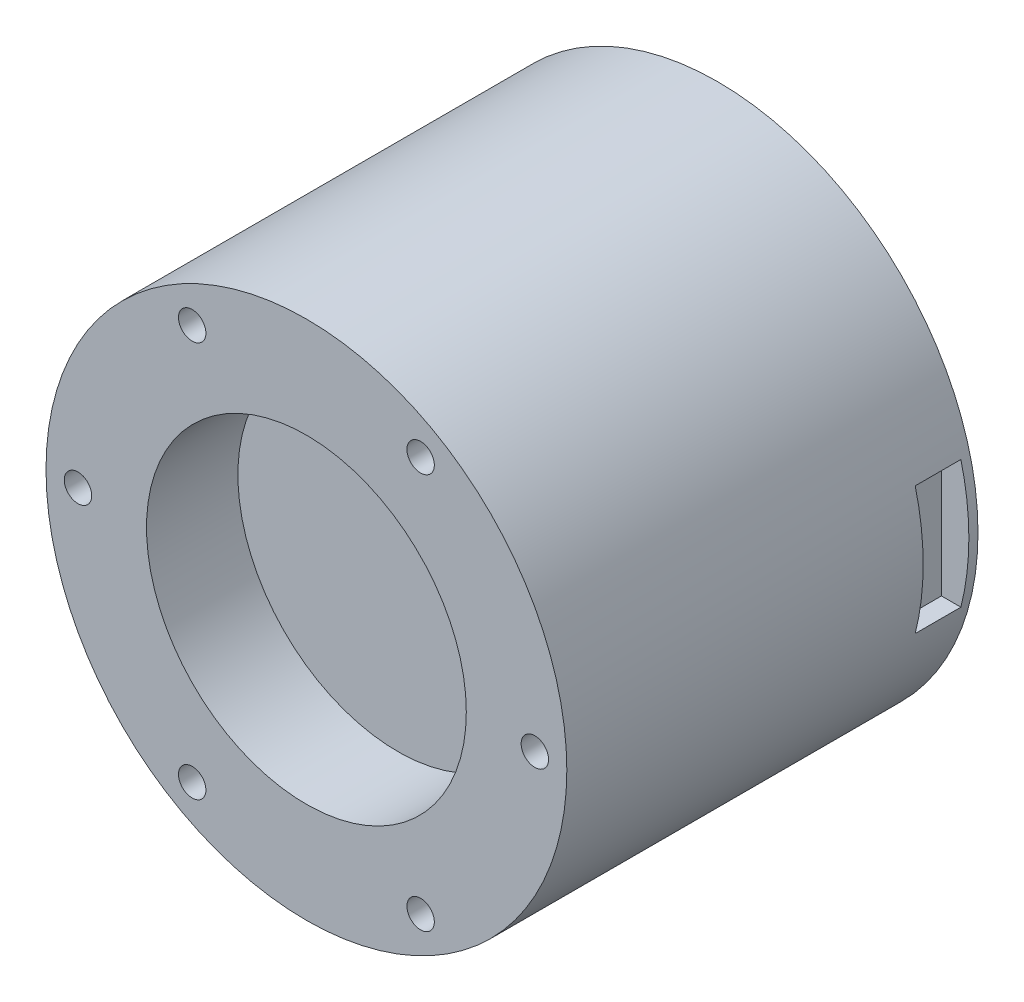
ISO-10303-21;
HEADER;
FILE_DESCRIPTION(('STEP AP214'),'2;1');
FILE_NAME('part.step','',(''),(''),'','','');
FILE_SCHEMA(('AUTOMOTIVE_DESIGN { 1 0 10303 214 1 1 1 1 }'));
ENDSEC;
DATA;
#1=APPLICATION_CONTEXT('core data for automotive mechanical design processes');
#2=APPLICATION_PROTOCOL_DEFINITION('international standard','automotive_design',2000,#1);
#3=PRODUCT_CONTEXT('',#1,'mechanical');
#4=PRODUCT('Part','Part','',(#3));
#5=PRODUCT_RELATED_PRODUCT_CATEGORY('part','',(#4));
#6=PRODUCT_DEFINITION_FORMATION('','',#4);
#7=PRODUCT_DEFINITION_CONTEXT('part definition',#1,'design');
#8=PRODUCT_DEFINITION('design','',#6,#7);
#9=PRODUCT_DEFINITION_SHAPE('','',#8);
#10=(LENGTH_UNIT() NAMED_UNIT(*) SI_UNIT(.MILLI.,.METRE.));
#11=(NAMED_UNIT(*) PLANE_ANGLE_UNIT() SI_UNIT($,.RADIAN.));
#12=(NAMED_UNIT(*) SI_UNIT($,.STERADIAN.) SOLID_ANGLE_UNIT());
#13=UNCERTAINTY_MEASURE_WITH_UNIT(LENGTH_MEASURE(1.E-05),#10,'distance_accuracy_value','');
#14=(GEOMETRIC_REPRESENTATION_CONTEXT(3) GLOBAL_UNCERTAINTY_ASSIGNED_CONTEXT((#13)) GLOBAL_UNIT_ASSIGNED_CONTEXT((#10,
#11,#12)) REPRESENTATION_CONTEXT('',''));
#15=CARTESIAN_POINT('',(0.,0.,0.));
#16=DIRECTION('',(0.,0.,1.));
#17=DIRECTION('',(1.,0.,0.));
#18=AXIS2_PLACEMENT_3D('',#15,#16,#17);
#19=CARTESIAN_POINT('',(0.,0.,45.));
#20=DIRECTION('',(0.,0.,-1.));
#21=DIRECTION('',(-1.,0.,0.));
#22=AXIS2_PLACEMENT_3D('',#19,#20,#21);
#23=CYLINDRICAL_SURFACE('',#22,28.5);
#24=DIRECTION('',(0.,0.,-1.));
#25=VECTOR('',#24,1.);
#26=CARTESIAN_POINT('',(-4.00000000000001,-28.2179021190449,9.));
#27=LINE('',#26,#25);
#28=CARTESIAN_POINT('',(-4.00000000000001,-28.2179021190449,9.));
#29=VERTEX_POINT('',#28);
#30=CARTESIAN_POINT('',(-4.00000000000001,-28.2179021190449,1.));
#31=VERTEX_POINT('',#30);
#32=EDGE_CURVE('E141',#29,#31,#27,.T.);
#33=ORIENTED_EDGE('',*,*,#32,.F.);
#34=CARTESIAN_POINT('',(0.,0.,9.));
#35=DIRECTION('',(0.,0.,-1.));
#36=DIRECTION('',(1.,0.,0.));
#37=AXIS2_PLACEMENT_3D('',#34,#35,#36);
#38=CIRCLE('',#37,28.5);
#39=CARTESIAN_POINT('',(3.99999999999999,-28.2179021190449,9.));
#40=VERTEX_POINT('',#39);
#41=EDGE_CURVE('E148',#40,#29,#38,.T.);
#42=ORIENTED_EDGE('',*,*,#41,.F.);
#43=DIRECTION('',(0.,0.,-1.));
#44=VECTOR('',#43,1.);
#45=CARTESIAN_POINT('',(3.99999999999999,-28.2179021190449,9.));
#46=LINE('',#45,#44);
#47=CARTESIAN_POINT('',(3.99999999999999,-28.2179021190449,1.));
#48=VERTEX_POINT('',#47);
#49=EDGE_CURVE('E131',#40,#48,#46,.T.);
#50=ORIENTED_EDGE('',*,*,#49,.T.);
#51=CARTESIAN_POINT('',(0.,0.,1.));
#52=DIRECTION('',(0.,0.,-1.));
#53=DIRECTION('',(1.,0.,0.));
#54=AXIS2_PLACEMENT_3D('',#51,#52,#53);
#55=CIRCLE('',#54,28.5);
#56=EDGE_CURVE('E161',#48,#31,#55,.T.);
#57=ORIENTED_EDGE('',*,*,#56,.T.);
#58=EDGE_LOOP('',(#33,#42,#50,#57));
#59=FACE_BOUND('',#58,.T.);
#60=DIRECTION('',(0.,0.,-1.));
#61=VECTOR('',#60,1.);
#62=CARTESIAN_POINT('',(-27.6269795670826,7.,45.));
#63=LINE('',#62,#61);
#64=CARTESIAN_POINT('',(-27.6269795670826,7.,1.));
#65=VERTEX_POINT('',#64);
#66=CARTESIAN_POINT('',(-27.6269795670826,7.,6.));
#67=VERTEX_POINT('',#66);
#68=EDGE_CURVE('E48',#65,#67,#63,.F.);
#69=ORIENTED_EDGE('',*,*,#68,.T.);
#70=CARTESIAN_POINT('',(0.,0.,6.));
#71=DIRECTION('',(0.,0.,1.));
#72=DIRECTION('',(1.,0.,0.));
#73=AXIS2_PLACEMENT_3D('',#70,#71,#72);
#74=CIRCLE('',#73,28.5);
#75=CARTESIAN_POINT('',(-27.6269795670826,-7.,6.));
#76=VERTEX_POINT('',#75);
#77=EDGE_CURVE('E11',#67,#76,#74,.T.);
#78=ORIENTED_EDGE('',*,*,#77,.T.);
#79=DIRECTION('',(0.,0.,-1.));
#80=VECTOR('',#79,1.);
#81=CARTESIAN_POINT('',(-27.6269795670826,-7.,45.));
#82=LINE('',#81,#80);
#83=CARTESIAN_POINT('',(-27.6269795670826,-7.,1.));
#84=VERTEX_POINT('',#83);
#85=EDGE_CURVE('E274',#76,#84,#82,.T.);
#86=ORIENTED_EDGE('',*,*,#85,.T.);
#87=CARTESIAN_POINT('',(0.,0.,1.));
#88=DIRECTION('',(0.,0.,1.));
#89=DIRECTION('',(1.,0.,0.));
#90=AXIS2_PLACEMENT_3D('',#87,#88,#89);
#91=CIRCLE('',#90,28.5);
#92=EDGE_CURVE('E272',#65,#84,#91,.T.);
#93=ORIENTED_EDGE('',*,*,#92,.F.);
#94=EDGE_LOOP('',(#69,#78,#86,#93));
#95=FACE_BOUND('',#94,.T.);
#96=CARTESIAN_POINT('',(0.,0.,0.));
#97=DIRECTION('',(0.,0.,1.));
#98=DIRECTION('',(1.,0.,0.));
#99=AXIS2_PLACEMENT_3D('',#96,#97,#98);
#100=CIRCLE('',#99,28.5);
#101=CARTESIAN_POINT('',(28.5,0.,0.));
#102=VERTEX_POINT('',#101);
#103=EDGE_CURVE('E253',#102,#102,#100,.T.);
#104=ORIENTED_EDGE('',*,*,#103,.T.);
#105=EDGE_LOOP('',(#104));
#106=FACE_BOUND('',#105,.T.);
#107=CARTESIAN_POINT('',(0.,0.,45.));
#108=DIRECTION('',(0.,0.,1.));
#109=DIRECTION('',(1.,0.,0.));
#110=AXIS2_PLACEMENT_3D('',#107,#108,#109);
#111=CIRCLE('',#110,28.5);
#112=CARTESIAN_POINT('',(28.5,0.,45.));
#113=VERTEX_POINT('',#112);
#114=EDGE_CURVE('E256',#113,#113,#111,.T.);
#115=ORIENTED_EDGE('',*,*,#114,.F.);
#116=EDGE_LOOP('',(#115));
#117=FACE_BOUND('',#116,.T.);
#118=CARTESIAN_POINT('',(0.,0.,6.));
#119=DIRECTION('',(0.,0.,-1.));
#120=DIRECTION('',(-1.,0.,0.));
#121=AXIS2_PLACEMENT_3D('',#118,#119,#120);
#122=CIRCLE('',#121,28.5);
#123=CARTESIAN_POINT('',(27.6269795670826,7.,6.));
#124=VERTEX_POINT('',#123);
#125=CARTESIAN_POINT('',(27.6269795670826,-7.,6.));
#126=VERTEX_POINT('',#125);
#127=EDGE_CURVE('E270',#124,#126,#122,.T.);
#128=ORIENTED_EDGE('',*,*,#127,.F.);
#129=DIRECTION('',(0.,0.,-1.));
#130=VECTOR('',#129,1.);
#131=CARTESIAN_POINT('',(27.6269795670826,7.,45.));
#132=LINE('',#131,#130);
#133=CARTESIAN_POINT('',(27.6269795670826,7.,1.));
#134=VERTEX_POINT('',#133);
#135=EDGE_CURVE('E264',#124,#134,#132,.T.);
#136=ORIENTED_EDGE('',*,*,#135,.T.);
#137=CARTESIAN_POINT('',(0.,0.,1.));
#138=DIRECTION('',(0.,0.,-1.));
#139=DIRECTION('',(-1.,0.,0.));
#140=AXIS2_PLACEMENT_3D('',#137,#138,#139);
#141=CIRCLE('',#140,28.5);
#142=CARTESIAN_POINT('',(27.6269795670826,-7.,1.));
#143=VERTEX_POINT('',#142);
#144=EDGE_CURVE('E259',#134,#143,#141,.T.);
#145=ORIENTED_EDGE('',*,*,#144,.T.);
#146=DIRECTION('',(0.,0.,-1.));
#147=VECTOR('',#146,1.);
#148=CARTESIAN_POINT('',(27.6269795670826,-7.,45.));
#149=LINE('',#148,#147);
#150=EDGE_CURVE('E267',#143,#126,#149,.F.);
#151=ORIENTED_EDGE('',*,*,#150,.T.);
#152=EDGE_LOOP('',(#128,#136,#145,#151));
#153=FACE_BOUND('',#152,.T.);
#154=ADVANCED_FACE('F41',(#59,#95,#106,#117,#153),#23,.T.);
#155=CARTESIAN_POINT('',(0.,0.,45.));
#156=DIRECTION('',(0.,0.,1.));
#157=DIRECTION('',(1.,0.,0.));
#158=AXIS2_PLACEMENT_3D('',#155,#156,#157);
#159=PLANE('',#158);
#160=CARTESIAN_POINT('',(0.,0.,45.));
#161=DIRECTION('',(0.,0.,1.));
#162=DIRECTION('',(1.,0.,0.));
#163=AXIS2_PLACEMENT_3D('',#160,#161,#162);
#164=CIRCLE('',#163,17.5);
#165=CARTESIAN_POINT('',(17.5,0.,45.));
#166=VERTEX_POINT('',#165);
#167=EDGE_CURVE('E193',#166,#166,#164,.T.);
#168=ORIENTED_EDGE('',*,*,#167,.F.);
#169=EDGE_LOOP('',(#168));
#170=FACE_BOUND('',#169,.T.);
#171=CARTESIAN_POINT('',(12.5000000000003,21.6506350946108,45.));
#172=DIRECTION('',(0.,0.,1.));
#173=DIRECTION('',(0.50000000000001,0.866025403784433,0.));
#174=AXIS2_PLACEMENT_3D('',#171,#172,#173);
#175=CIRCLE('',#174,1.5);
#176=CARTESIAN_POINT('',(13.2500000000003,22.9496732002875,45.));
#177=VERTEX_POINT('',#176);
#178=EDGE_CURVE('E217',#177,#177,#175,.T.);
#179=ORIENTED_EDGE('',*,*,#178,.F.);
#180=EDGE_LOOP('',(#179));
#181=FACE_BOUND('',#180,.T.);
#182=CARTESIAN_POINT('',(-12.4999999999998,21.6506350946111,45.));
#183=DIRECTION('',(0.,0.,1.));
#184=DIRECTION('',(-0.499999999999992,0.866025403784443,0.));
#185=AXIS2_PLACEMENT_3D('',#182,#183,#184);
#186=CIRCLE('',#185,1.5);
#187=CARTESIAN_POINT('',(-13.2499999999998,22.9496732002877,45.));
#188=VERTEX_POINT('',#187);
#189=EDGE_CURVE('E236',#188,#188,#186,.T.);
#190=ORIENTED_EDGE('',*,*,#189,.F.);
#191=EDGE_LOOP('',(#190));
#192=FACE_BOUND('',#191,.T.);
#193=CARTESIAN_POINT('',(-25.,0.,45.));
#194=DIRECTION('',(0.,0.,1.));
#195=DIRECTION('',(-1.,0.,0.));
#196=AXIS2_PLACEMENT_3D('',#193,#194,#195);
#197=CIRCLE('',#196,1.5);
#198=CARTESIAN_POINT('',(-26.5,0.,45.));
#199=VERTEX_POINT('',#198);
#200=EDGE_CURVE('E230',#199,#199,#197,.T.);
#201=ORIENTED_EDGE('',*,*,#200,.F.);
#202=EDGE_LOOP('',(#201));
#203=FACE_BOUND('',#202,.T.);
#204=CARTESIAN_POINT('',(-12.5000000000001,-21.6506350946109,45.));
#205=DIRECTION('',(0.,0.,1.));
#206=DIRECTION('',(-0.500000000000004,-0.866025403784436,0.));
#207=AXIS2_PLACEMENT_3D('',#204,#205,#206);
#208=CIRCLE('',#207,1.5);
#209=CARTESIAN_POINT('',(-13.2500000000001,-22.9496732002876,45.));
#210=VERTEX_POINT('',#209);
#211=EDGE_CURVE('E224',#210,#210,#208,.T.);
#212=ORIENTED_EDGE('',*,*,#211,.F.);
#213=EDGE_LOOP('',(#212));
#214=FACE_BOUND('',#213,.T.);
#215=CARTESIAN_POINT('',(12.5,-21.650635094611,45.));
#216=DIRECTION('',(0.,0.,1.));
#217=DIRECTION('',(0.499999999999998,-0.86602540378444,0.));
#218=AXIS2_PLACEMENT_3D('',#215,#216,#217);
#219=CIRCLE('',#218,1.5);
#220=CARTESIAN_POINT('',(13.2499999999999,-22.9496732002877,45.));
#221=VERTEX_POINT('',#220);
#222=EDGE_CURVE('E223',#221,#221,#219,.T.);
#223=ORIENTED_EDGE('',*,*,#222,.F.);
#224=EDGE_LOOP('',(#223));
#225=FACE_BOUND('',#224,.T.);
#226=CARTESIAN_POINT('',(25.,0.,45.));
#227=DIRECTION('',(0.,0.,1.));
#228=DIRECTION('',(1.,0.,0.));
#229=AXIS2_PLACEMENT_3D('',#226,#227,#228);
#230=CIRCLE('',#229,1.5);
#231=CARTESIAN_POINT('',(26.5,0.,45.));
#232=VERTEX_POINT('',#231);
#233=EDGE_CURVE('E247',#232,#232,#230,.T.);
#234=ORIENTED_EDGE('',*,*,#233,.F.);
#235=EDGE_LOOP('',(#234));
#236=FACE_BOUND('',#235,.T.);
#237=ORIENTED_EDGE('',*,*,#114,.T.);
#238=EDGE_LOOP('',(#237));
#239=FACE_BOUND('',#238,.T.);
#240=ADVANCED_FACE('F305',(#170,#181,#192,#203,#214,#225,#236,#239),#159,.T.);
#241=CARTESIAN_POINT('',(0.,0.,0.));
#242=DIRECTION('',(0.,0.,1.));
#243=DIRECTION('',(1.,0.,0.));
#244=AXIS2_PLACEMENT_3D('',#241,#242,#243);
#245=PLANE('',#244);
#246=CARTESIAN_POINT('',(-13.4350288425443,-13.4350288425445,0.));
#247=DIRECTION('',(0.,0.,-1.));
#248=DIRECTION('',(0.,-1.,0.));
#249=AXIS2_PLACEMENT_3D('',#246,#247,#248);
#250=CIRCLE('',#249,1.5);
#251=CARTESIAN_POINT('',(-13.4350288425443,-14.9350288425445,0.));
#252=VERTEX_POINT('',#251);
#253=EDGE_CURVE('E461',#252,#252,#250,.T.);
#254=ORIENTED_EDGE('',*,*,#253,.F.);
#255=EDGE_LOOP('',(#254));
#256=FACE_BOUND('',#255,.T.);
#257=CARTESIAN_POINT('',(13.4350288425445,-13.4350288425443,0.));
#258=DIRECTION('',(0.,0.,-1.));
#259=DIRECTION('',(1.,0.,0.));
#260=AXIS2_PLACEMENT_3D('',#257,#258,#259);
#261=CIRCLE('',#260,1.5);
#262=CARTESIAN_POINT('',(14.9350288425445,-13.4350288425443,0.));
#263=VERTEX_POINT('',#262);
#264=EDGE_CURVE('E470',#263,#263,#261,.T.);
#265=ORIENTED_EDGE('',*,*,#264,.F.);
#266=EDGE_LOOP('',(#265));
#267=FACE_BOUND('',#266,.T.);
#268=CARTESIAN_POINT('',(13.4350288425442,13.4350288425446,0.));
#269=DIRECTION('',(0.,0.,-1.));
#270=DIRECTION('',(0.,1.,0.));
#271=AXIS2_PLACEMENT_3D('',#268,#269,#270);
#272=CIRCLE('',#271,1.5);
#273=CARTESIAN_POINT('',(13.4350288425442,14.9350288425446,0.));
#274=VERTEX_POINT('',#273);
#275=EDGE_CURVE('E476',#274,#274,#272,.T.);
#276=ORIENTED_EDGE('',*,*,#275,.F.);
#277=EDGE_LOOP('',(#276));
#278=FACE_BOUND('',#277,.T.);
#279=CARTESIAN_POINT('',(-13.4350288425445,13.4350288425443,0.));
#280=DIRECTION('',(0.,0.,-1.));
#281=DIRECTION('',(-1.,0.,0.));
#282=AXIS2_PLACEMENT_3D('',#279,#280,#281);
#283=CIRCLE('',#282,1.5);
#284=CARTESIAN_POINT('',(-14.9350288425445,13.4350288425443,0.));
#285=VERTEX_POINT('',#284);
#286=EDGE_CURVE('E460',#285,#285,#283,.T.);
#287=ORIENTED_EDGE('',*,*,#286,.F.);
#288=EDGE_LOOP('',(#287));
#289=FACE_BOUND('',#288,.T.);
#290=ORIENTED_EDGE('',*,*,#103,.F.);
#291=EDGE_LOOP('',(#290));
#292=FACE_BOUND('',#291,.T.);
#293=ADVANCED_FACE('F309',(#256,#267,#278,#289,#292),#245,.F.);
#294=CARTESIAN_POINT('',(25.,0.,40.));
#295=DIRECTION('',(0.,0.,1.));
#296=DIRECTION('',(1.,0.,0.));
#297=AXIS2_PLACEMENT_3D('',#294,#295,#296);
#298=CYLINDRICAL_SURFACE('',#297,1.5);
#299=CARTESIAN_POINT('',(25.,0.,40.));
#300=DIRECTION('',(0.,0.,1.));
#301=DIRECTION('',(1.,0.,0.));
#302=AXIS2_PLACEMENT_3D('',#299,#300,#301);
#303=CIRCLE('',#302,1.5);
#304=CARTESIAN_POINT('',(26.5,0.,40.));
#305=VERTEX_POINT('',#304);
#306=EDGE_CURVE('E250',#305,#305,#303,.T.);
#307=ORIENTED_EDGE('',*,*,#306,.F.);
#308=EDGE_LOOP('',(#307));
#309=FACE_BOUND('',#308,.T.);
#310=ORIENTED_EDGE('',*,*,#233,.T.);
#311=EDGE_LOOP('',(#310));
#312=FACE_BOUND('',#311,.T.);
#313=ADVANCED_FACE('F315',(#309,#312),#298,.F.);
#314=CARTESIAN_POINT('',(25.,0.,40.));
#315=DIRECTION('',(0.,0.,1.));
#316=DIRECTION('',(1.,0.,0.));
#317=AXIS2_PLACEMENT_3D('',#314,#315,#316);
#318=PLANE('',#317);
#319=ORIENTED_EDGE('',*,*,#306,.T.);
#320=EDGE_LOOP('',(#319));
#321=FACE_BOUND('',#320,.T.);
#322=ADVANCED_FACE('F322',(#321),#318,.T.);
#323=CARTESIAN_POINT('',(12.5,-21.650635094611,40.));
#324=DIRECTION('',(0.,0.,1.));
#325=DIRECTION('',(1.,0.,0.));
#326=AXIS2_PLACEMENT_3D('',#323,#324,#325);
#327=CYLINDRICAL_SURFACE('',#326,1.5);
#328=CARTESIAN_POINT('',(12.5,-21.650635094611,40.));
#329=DIRECTION('',(0.,0.,1.));
#330=DIRECTION('',(0.499999999999998,-0.86602540378444,0.));
#331=AXIS2_PLACEMENT_3D('',#328,#329,#330);
#332=CIRCLE('',#331,1.5);
#333=CARTESIAN_POINT('',(13.2499999999999,-22.9496732002877,40.));
#334=VERTEX_POINT('',#333);
#335=EDGE_CURVE('E244',#334,#334,#332,.T.);
#336=ORIENTED_EDGE('',*,*,#335,.F.);
#337=EDGE_LOOP('',(#336));
#338=FACE_BOUND('',#337,.T.);
#339=ORIENTED_EDGE('',*,*,#222,.T.);
#340=EDGE_LOOP('',(#339));
#341=FACE_BOUND('',#340,.T.);
#342=ADVANCED_FACE('F326',(#338,#341),#327,.F.);
#343=CARTESIAN_POINT('',(12.5,-21.650635094611,40.));
#344=DIRECTION('',(0.,0.,1.));
#345=DIRECTION('',(0.499999999999998,-0.86602540378444,0.));
#346=AXIS2_PLACEMENT_3D('',#343,#344,#345);
#347=PLANE('',#346);
#348=ORIENTED_EDGE('',*,*,#335,.T.);
#349=EDGE_LOOP('',(#348));
#350=FACE_BOUND('',#349,.T.);
#351=ADVANCED_FACE('F330',(#350),#347,.T.);
#352=CARTESIAN_POINT('',(-12.5000000000001,-21.6506350946109,40.));
#353=DIRECTION('',(0.,0.,1.));
#354=DIRECTION('',(1.,0.,0.));
#355=AXIS2_PLACEMENT_3D('',#352,#353,#354);
#356=CYLINDRICAL_SURFACE('',#355,1.5);
#357=CARTESIAN_POINT('',(-12.5000000000001,-21.6506350946109,40.));
#358=DIRECTION('',(0.,0.,1.));
#359=DIRECTION('',(-0.500000000000004,-0.866025403784436,0.));
#360=AXIS2_PLACEMENT_3D('',#357,#358,#359);
#361=CIRCLE('',#360,1.5);
#362=CARTESIAN_POINT('',(-13.2500000000001,-22.9496732002876,40.));
#363=VERTEX_POINT('',#362);
#364=EDGE_CURVE('E220',#363,#363,#361,.T.);
#365=ORIENTED_EDGE('',*,*,#364,.F.);
#366=EDGE_LOOP('',(#365));
#367=FACE_BOUND('',#366,.T.);
#368=ORIENTED_EDGE('',*,*,#211,.T.);
#369=EDGE_LOOP('',(#368));
#370=FACE_BOUND('',#369,.T.);
#371=ADVANCED_FACE('F334',(#367,#370),#356,.F.);
#372=CARTESIAN_POINT('',(-12.5000000000001,-21.6506350946109,40.));
#373=DIRECTION('',(0.,0.,1.));
#374=DIRECTION('',(-0.500000000000004,-0.866025403784436,0.));
#375=AXIS2_PLACEMENT_3D('',#372,#373,#374);
#376=PLANE('',#375);
#377=ORIENTED_EDGE('',*,*,#364,.T.);
#378=EDGE_LOOP('',(#377));
#379=FACE_BOUND('',#378,.T.);
#380=ADVANCED_FACE('F357',(#379),#376,.T.);
#381=CARTESIAN_POINT('',(-25.,0.,40.));
#382=DIRECTION('',(0.,0.,1.));
#383=DIRECTION('',(1.,0.,0.));
#384=AXIS2_PLACEMENT_3D('',#381,#382,#383);
#385=CYLINDRICAL_SURFACE('',#384,1.5);
#386=CARTESIAN_POINT('',(-25.,0.,40.));
#387=DIRECTION('',(0.,0.,1.));
#388=DIRECTION('',(-1.,0.,0.));
#389=AXIS2_PLACEMENT_3D('',#386,#387,#388);
#390=CIRCLE('',#389,1.5);
#391=CARTESIAN_POINT('',(-26.5,0.,40.));
#392=VERTEX_POINT('',#391);
#393=EDGE_CURVE('E227',#392,#392,#390,.T.);
#394=ORIENTED_EDGE('',*,*,#393,.F.);
#395=EDGE_LOOP('',(#394));
#396=FACE_BOUND('',#395,.T.);
#397=ORIENTED_EDGE('',*,*,#200,.T.);
#398=EDGE_LOOP('',(#397));
#399=FACE_BOUND('',#398,.T.);
#400=ADVANCED_FACE('F354',(#396,#399),#385,.F.);
#401=CARTESIAN_POINT('',(-25.,0.,40.));
#402=DIRECTION('',(0.,0.,1.));
#403=DIRECTION('',(-1.,0.,0.));
#404=AXIS2_PLACEMENT_3D('',#401,#402,#403);
#405=PLANE('',#404);
#406=ORIENTED_EDGE('',*,*,#393,.T.);
#407=EDGE_LOOP('',(#406));
#408=FACE_BOUND('',#407,.T.);
#409=ADVANCED_FACE('F349',(#408),#405,.T.);
#410=CARTESIAN_POINT('',(-12.4999999999998,21.6506350946111,40.));
#411=DIRECTION('',(0.,0.,1.));
#412=DIRECTION('',(1.,0.,0.));
#413=AXIS2_PLACEMENT_3D('',#410,#411,#412);
#414=CYLINDRICAL_SURFACE('',#413,1.5);
#415=CARTESIAN_POINT('',(-12.4999999999998,21.6506350946111,40.));
#416=DIRECTION('',(0.,0.,1.));
#417=DIRECTION('',(-0.499999999999992,0.866025403784443,0.));
#418=AXIS2_PLACEMENT_3D('',#415,#416,#417);
#419=CIRCLE('',#418,1.5);
#420=CARTESIAN_POINT('',(-13.2499999999998,22.9496732002877,40.));
#421=VERTEX_POINT('',#420);
#422=EDGE_CURVE('E233',#421,#421,#419,.T.);
#423=ORIENTED_EDGE('',*,*,#422,.F.);
#424=EDGE_LOOP('',(#423));
#425=FACE_BOUND('',#424,.T.);
#426=ORIENTED_EDGE('',*,*,#189,.T.);
#427=EDGE_LOOP('',(#426));
#428=FACE_BOUND('',#427,.T.);
#429=ADVANCED_FACE('F346',(#425,#428),#414,.F.);
#430=CARTESIAN_POINT('',(-12.4999999999998,21.6506350946111,40.));
#431=DIRECTION('',(0.,0.,1.));
#432=DIRECTION('',(-0.499999999999992,0.866025403784443,0.));
#433=AXIS2_PLACEMENT_3D('',#430,#431,#432);
#434=PLANE('',#433);
#435=ORIENTED_EDGE('',*,*,#422,.T.);
#436=EDGE_LOOP('',(#435));
#437=FACE_BOUND('',#436,.T.);
#438=ADVANCED_FACE('F340',(#437),#434,.T.);
#439=CARTESIAN_POINT('',(12.5000000000003,21.6506350946108,40.));
#440=DIRECTION('',(0.,0.,1.));
#441=DIRECTION('',(1.,0.,0.));
#442=AXIS2_PLACEMENT_3D('',#439,#440,#441);
#443=CYLINDRICAL_SURFACE('',#442,1.5);
#444=CARTESIAN_POINT('',(12.5000000000003,21.6506350946108,40.));
#445=DIRECTION('',(0.,0.,1.));
#446=DIRECTION('',(0.50000000000001,0.866025403784433,0.));
#447=AXIS2_PLACEMENT_3D('',#444,#445,#446);
#448=CIRCLE('',#447,1.5);
#449=CARTESIAN_POINT('',(13.2500000000003,22.9496732002875,40.));
#450=VERTEX_POINT('',#449);
#451=EDGE_CURVE('E239',#450,#450,#448,.T.);
#452=ORIENTED_EDGE('',*,*,#451,.F.);
#453=EDGE_LOOP('',(#452));
#454=FACE_BOUND('',#453,.T.);
#455=ORIENTED_EDGE('',*,*,#178,.T.);
#456=EDGE_LOOP('',(#455));
#457=FACE_BOUND('',#456,.T.);
#458=ADVANCED_FACE('F336',(#454,#457),#443,.F.);
#459=CARTESIAN_POINT('',(12.5000000000003,21.6506350946108,40.));
#460=DIRECTION('',(0.,0.,1.));
#461=DIRECTION('',(0.50000000000001,0.866025403784433,0.));
#462=AXIS2_PLACEMENT_3D('',#459,#460,#461);
#463=PLANE('',#462);
#464=ORIENTED_EDGE('',*,*,#451,.T.);
#465=EDGE_LOOP('',(#464));
#466=FACE_BOUND('',#465,.T.);
#467=ADVANCED_FACE('F339',(#466),#463,.T.);
#468=CARTESIAN_POINT('',(0.,0.,35.));
#469=DIRECTION('',(0.,0.,1.));
#470=DIRECTION('',(1.,0.,0.));
#471=AXIS2_PLACEMENT_3D('',#468,#469,#470);
#472=CYLINDRICAL_SURFACE('',#471,17.5);
#473=CARTESIAN_POINT('',(0.,0.,35.));
#474=DIRECTION('',(0.,0.,1.));
#475=DIRECTION('',(1.,0.,0.));
#476=AXIS2_PLACEMENT_3D('',#473,#474,#475);
#477=CIRCLE('',#476,17.5);
#478=CARTESIAN_POINT('',(17.5,0.,35.));
#479=VERTEX_POINT('',#478);
#480=EDGE_CURVE('E214',#479,#479,#477,.T.);
#481=ORIENTED_EDGE('',*,*,#480,.F.);
#482=EDGE_LOOP('',(#481));
#483=FACE_BOUND('',#482,.T.);
#484=ORIENTED_EDGE('',*,*,#167,.T.);
#485=EDGE_LOOP('',(#484));
#486=FACE_BOUND('',#485,.T.);
#487=ADVANCED_FACE('F344',(#483,#486),#472,.F.);
#488=CARTESIAN_POINT('',(0.,0.,35.));
#489=DIRECTION('',(0.,0.,1.));
#490=DIRECTION('',(1.,0.,0.));
#491=AXIS2_PLACEMENT_3D('',#488,#489,#490);
#492=PLANE('',#491);
#493=ORIENTED_EDGE('',*,*,#480,.T.);
#494=EDGE_LOOP('',(#493));
#495=FACE_BOUND('',#494,.T.);
#496=ADVANCED_FACE('F370',(#495),#492,.T.);
#497=CARTESIAN_POINT('',(25.5,-7.,6.));
#498=DIRECTION('',(0.,-1.,0.));
#499=DIRECTION('',(0.,0.,-1.));
#500=AXIS2_PLACEMENT_3D('',#497,#498,#499);
#501=PLANE('',#500);
#502=DIRECTION('',(-1.,0.,0.));
#503=VECTOR('',#502,1.);
#504=CARTESIAN_POINT('',(25.5,-7.,1.));
#505=LINE('',#504,#503);
#506=CARTESIAN_POINT('',(25.5,-7.,1.));
#507=VERTEX_POINT('',#506);
#508=EDGE_CURVE('E200',#143,#507,#505,.T.);
#509=ORIENTED_EDGE('',*,*,#508,.T.);
#510=DIRECTION('',(0.,0.,-1.));
#511=VECTOR('',#510,1.);
#512=CARTESIAN_POINT('',(25.5,-7.,6.));
#513=LINE('',#512,#511);
#514=CARTESIAN_POINT('',(25.5,-7.,6.));
#515=VERTEX_POINT('',#514);
#516=EDGE_CURVE('E169',#515,#507,#513,.T.);
#517=ORIENTED_EDGE('',*,*,#516,.F.);
#518=DIRECTION('',(-1.,0.,0.));
#519=VECTOR('',#518,1.);
#520=CARTESIAN_POINT('',(25.5,-7.,6.));
#521=LINE('',#520,#519);
#522=EDGE_CURVE('E197',#126,#515,#521,.T.);
#523=ORIENTED_EDGE('',*,*,#522,.F.);
#524=ORIENTED_EDGE('',*,*,#150,.F.);
#525=EDGE_LOOP('',(#509,#517,#523,#524));
#526=FACE_BOUND('',#525,.T.);
#527=ADVANCED_FACE('F374',(#526),#501,.F.);
#528=CARTESIAN_POINT('',(25.5,7.,6.));
#529=DIRECTION('',(0.,1.,0.));
#530=DIRECTION('',(0.,0.,1.));
#531=AXIS2_PLACEMENT_3D('',#528,#529,#530);
#532=PLANE('',#531);
#533=DIRECTION('',(1.,0.,0.));
#534=VECTOR('',#533,1.);
#535=CARTESIAN_POINT('',(25.5,7.,6.));
#536=LINE('',#535,#534);
#537=CARTESIAN_POINT('',(25.5,7.,6.));
#538=VERTEX_POINT('',#537);
#539=EDGE_CURVE('E209',#538,#124,#536,.T.);
#540=ORIENTED_EDGE('',*,*,#539,.F.);
#541=DIRECTION('',(0.,0.,-1.));
#542=VECTOR('',#541,1.);
#543=CARTESIAN_POINT('',(25.5,7.,6.));
#544=LINE('',#543,#542);
#545=CARTESIAN_POINT('',(25.5,7.,1.));
#546=VERTEX_POINT('',#545);
#547=EDGE_CURVE('E195',#538,#546,#544,.T.);
#548=ORIENTED_EDGE('',*,*,#547,.T.);
#549=DIRECTION('',(1.,0.,0.));
#550=VECTOR('',#549,1.);
#551=CARTESIAN_POINT('',(25.5,7.,1.));
#552=LINE('',#551,#550);
#553=EDGE_CURVE('E202',#546,#134,#552,.T.);
#554=ORIENTED_EDGE('',*,*,#553,.T.);
#555=ORIENTED_EDGE('',*,*,#135,.F.);
#556=EDGE_LOOP('',(#540,#548,#554,#555));
#557=FACE_BOUND('',#556,.T.);
#558=ADVANCED_FACE('F380',(#557),#532,.F.);
#559=CARTESIAN_POINT('',(0.,0.,6.));
#560=DIRECTION('',(0.,0.,-1.));
#561=DIRECTION('',(-1.,0.,0.));
#562=AXIS2_PLACEMENT_3D('',#559,#560,#561);
#563=PLANE('',#562);
#564=ORIENTED_EDGE('',*,*,#127,.T.);
#565=ORIENTED_EDGE('',*,*,#522,.T.);
#566=DIRECTION('',(0.,1.,0.));
#567=VECTOR('',#566,1.);
#568=CARTESIAN_POINT('',(25.5,7.,6.));
#569=LINE('',#568,#567);
#570=EDGE_CURVE('E203',#515,#538,#569,.T.);
#571=ORIENTED_EDGE('',*,*,#570,.T.);
#572=ORIENTED_EDGE('',*,*,#539,.T.);
#573=EDGE_LOOP('',(#564,#565,#571,#572));
#574=FACE_BOUND('',#573,.T.);
#575=ADVANCED_FACE('F376',(#574),#563,.T.);
#576=CARTESIAN_POINT('',(0.,0.,1.));
#577=DIRECTION('',(0.,0.,-1.));
#578=DIRECTION('',(-1.,0.,0.));
#579=AXIS2_PLACEMENT_3D('',#576,#577,#578);
#580=PLANE('',#579);
#581=ORIENTED_EDGE('',*,*,#553,.F.);
#582=DIRECTION('',(0.,1.,0.));
#583=VECTOR('',#582,1.);
#584=CARTESIAN_POINT('',(25.5,7.,1.));
#585=LINE('',#584,#583);
#586=EDGE_CURVE('E186',#507,#546,#585,.T.);
#587=ORIENTED_EDGE('',*,*,#586,.F.);
#588=ORIENTED_EDGE('',*,*,#508,.F.);
#589=ORIENTED_EDGE('',*,*,#144,.F.);
#590=EDGE_LOOP('',(#581,#587,#588,#589));
#591=FACE_BOUND('',#590,.T.);
#592=ADVANCED_FACE('F379',(#591),#580,.F.);
#593=CARTESIAN_POINT('',(25.5,7.,6.));
#594=DIRECTION('',(-1.,0.,0.));
#595=DIRECTION('',(0.,0.,1.));
#596=AXIS2_PLACEMENT_3D('',#593,#594,#595);
#597=PLANE('',#596);
#598=ORIENTED_EDGE('',*,*,#586,.T.);
#599=ORIENTED_EDGE('',*,*,#547,.F.);
#600=ORIENTED_EDGE('',*,*,#570,.F.);
#601=ORIENTED_EDGE('',*,*,#516,.T.);
#602=EDGE_LOOP('',(#598,#599,#600,#601));
#603=FACE_BOUND('',#602,.T.);
#604=ADVANCED_FACE('F384',(#603),#597,.F.);
#605=CARTESIAN_POINT('',(-25.5,7.,6.));
#606=DIRECTION('',(0.,1.,0.));
#607=DIRECTION('',(0.,0.,1.));
#608=AXIS2_PLACEMENT_3D('',#605,#606,#607);
#609=PLANE('',#608);
#610=DIRECTION('',(1.,0.,0.));
#611=VECTOR('',#610,1.);
#612=CARTESIAN_POINT('',(-25.5,7.,1.));
#613=LINE('',#612,#611);
#614=CARTESIAN_POINT('',(-25.5,7.,1.));
#615=VERTEX_POINT('',#614);
#616=EDGE_CURVE('E63',#65,#615,#613,.T.);
#617=ORIENTED_EDGE('',*,*,#616,.T.);
#618=DIRECTION('',(0.,0.,-1.));
#619=VECTOR('',#618,1.);
#620=CARTESIAN_POINT('',(-25.5,7.,6.));
#621=LINE('',#620,#619);
#622=CARTESIAN_POINT('',(-25.5,7.,6.));
#623=VERTEX_POINT('',#622);
#624=EDGE_CURVE('E190',#623,#615,#621,.T.);
#625=ORIENTED_EDGE('',*,*,#624,.F.);
#626=DIRECTION('',(1.,0.,0.));
#627=VECTOR('',#626,1.);
#628=CARTESIAN_POINT('',(-25.5,7.,6.));
#629=LINE('',#628,#627);
#630=EDGE_CURVE('E179',#67,#623,#629,.T.);
#631=ORIENTED_EDGE('',*,*,#630,.F.);
#632=ORIENTED_EDGE('',*,*,#68,.F.);
#633=EDGE_LOOP('',(#617,#625,#631,#632));
#634=FACE_BOUND('',#633,.T.);
#635=ADVANCED_FACE('F281',(#634),#609,.F.);
#636=CARTESIAN_POINT('',(-25.5,-7.,6.));
#637=DIRECTION('',(0.,-1.,0.));
#638=DIRECTION('',(0.,0.,-1.));
#639=AXIS2_PLACEMENT_3D('',#636,#637,#638);
#640=PLANE('',#639);
#641=DIRECTION('',(-1.,0.,0.));
#642=VECTOR('',#641,1.);
#643=CARTESIAN_POINT('',(-25.5,-7.,6.));
#644=LINE('',#643,#642);
#645=CARTESIAN_POINT('',(-25.5,-7.,6.));
#646=VERTEX_POINT('',#645);
#647=EDGE_CURVE('E176',#646,#76,#644,.T.);
#648=ORIENTED_EDGE('',*,*,#647,.F.);
#649=DIRECTION('',(0.,0.,-1.));
#650=VECTOR('',#649,1.);
#651=CARTESIAN_POINT('',(-25.5,-7.,6.));
#652=LINE('',#651,#650);
#653=CARTESIAN_POINT('',(-25.5,-7.,1.));
#654=VERTEX_POINT('',#653);
#655=EDGE_CURVE('E181',#646,#654,#652,.T.);
#656=ORIENTED_EDGE('',*,*,#655,.T.);
#657=DIRECTION('',(-1.,0.,0.));
#658=VECTOR('',#657,1.);
#659=CARTESIAN_POINT('',(-25.5,-7.,1.));
#660=LINE('',#659,#658);
#661=EDGE_CURVE('E185',#654,#84,#660,.T.);
#662=ORIENTED_EDGE('',*,*,#661,.T.);
#663=ORIENTED_EDGE('',*,*,#85,.F.);
#664=EDGE_LOOP('',(#648,#656,#662,#663));
#665=FACE_BOUND('',#664,.T.);
#666=ADVANCED_FACE('F288',(#665),#640,.F.);
#667=CARTESIAN_POINT('',(0.,0.,6.));
#668=DIRECTION('',(0.,0.,1.));
#669=DIRECTION('',(1.,0.,0.));
#670=AXIS2_PLACEMENT_3D('',#667,#668,#669);
#671=PLANE('',#670);
#672=ORIENTED_EDGE('',*,*,#630,.T.);
#673=DIRECTION('',(0.,-1.,0.));
#674=VECTOR('',#673,1.);
#675=CARTESIAN_POINT('',(-25.5,7.,6.));
#676=LINE('',#675,#674);
#677=EDGE_CURVE('E173',#623,#646,#676,.T.);
#678=ORIENTED_EDGE('',*,*,#677,.T.);
#679=ORIENTED_EDGE('',*,*,#647,.T.);
#680=ORIENTED_EDGE('',*,*,#77,.F.);
#681=EDGE_LOOP('',(#672,#678,#679,#680));
#682=FACE_BOUND('',#681,.T.);
#683=ADVANCED_FACE('F285',(#682),#671,.F.);
#684=CARTESIAN_POINT('',(0.,0.,1.));
#685=DIRECTION('',(0.,0.,1.));
#686=DIRECTION('',(1.,0.,0.));
#687=AXIS2_PLACEMENT_3D('',#684,#685,#686);
#688=PLANE('',#687);
#689=ORIENTED_EDGE('',*,*,#92,.T.);
#690=ORIENTED_EDGE('',*,*,#661,.F.);
#691=DIRECTION('',(0.,-1.,0.));
#692=VECTOR('',#691,1.);
#693=CARTESIAN_POINT('',(-25.5,7.,1.));
#694=LINE('',#693,#692);
#695=EDGE_CURVE('E182',#615,#654,#694,.T.);
#696=ORIENTED_EDGE('',*,*,#695,.F.);
#697=ORIENTED_EDGE('',*,*,#616,.F.);
#698=EDGE_LOOP('',(#689,#690,#696,#697));
#699=FACE_BOUND('',#698,.T.);
#700=ADVANCED_FACE('F290',(#699),#688,.T.);
#701=CARTESIAN_POINT('',(-25.5,7.,6.));
#702=DIRECTION('',(1.,0.,0.));
#703=DIRECTION('',(0.,0.,-1.));
#704=AXIS2_PLACEMENT_3D('',#701,#702,#703);
#705=PLANE('',#704);
#706=ORIENTED_EDGE('',*,*,#695,.T.);
#707=ORIENTED_EDGE('',*,*,#655,.F.);
#708=ORIENTED_EDGE('',*,*,#677,.F.);
#709=ORIENTED_EDGE('',*,*,#624,.T.);
#710=EDGE_LOOP('',(#706,#707,#708,#709));
#711=FACE_BOUND('',#710,.T.);
#712=ADVANCED_FACE('F292',(#711),#705,.F.);
#713=CARTESIAN_POINT('',(4.00000000000001,-25.5,9.));
#714=DIRECTION('',(1.,0.,0.));
#715=DIRECTION('',(0.,0.,-1.));
#716=AXIS2_PLACEMENT_3D('',#713,#714,#715);
#717=PLANE('',#716);
#718=DIRECTION('',(0.,-1.,0.));
#719=VECTOR('',#718,1.);
#720=CARTESIAN_POINT('',(4.00000000000001,-25.5,1.));
#721=LINE('',#720,#719);
#722=CARTESIAN_POINT('',(4.00000000000001,-25.5,1.));
#723=VERTEX_POINT('',#722);
#724=EDGE_CURVE('E137',#723,#48,#721,.T.);
#725=ORIENTED_EDGE('',*,*,#724,.T.);
#726=ORIENTED_EDGE('',*,*,#49,.F.);
#727=DIRECTION('',(0.,-1.,0.));
#728=VECTOR('',#727,1.);
#729=CARTESIAN_POINT('',(4.00000000000001,-25.5,9.));
#730=LINE('',#729,#728);
#731=CARTESIAN_POINT('',(4.00000000000001,-25.5,9.));
#732=VERTEX_POINT('',#731);
#733=EDGE_CURVE('E134',#732,#40,#730,.T.);
#734=ORIENTED_EDGE('',*,*,#733,.F.);
#735=DIRECTION('',(0.,0.,-1.));
#736=VECTOR('',#735,1.);
#737=CARTESIAN_POINT('',(4.00000000000001,-25.5,9.));
#738=LINE('',#737,#736);
#739=EDGE_CURVE('E167',#732,#723,#738,.T.);
#740=ORIENTED_EDGE('',*,*,#739,.T.);
#741=EDGE_LOOP('',(#725,#726,#734,#740));
#742=FACE_BOUND('',#741,.T.);
#743=ADVANCED_FACE('F133',(#742),#717,.F.);
#744=CARTESIAN_POINT('',(4.00000000000001,-25.5,9.));
#745=DIRECTION('',(0.,1.,0.));
#746=DIRECTION('',(0.,0.,1.));
#747=AXIS2_PLACEMENT_3D('',#744,#745,#746);
#748=PLANE('',#747);
#749=DIRECTION('',(1.,0.,0.));
#750=VECTOR('',#749,1.);
#751=CARTESIAN_POINT('',(4.00000000000001,-25.5,1.));
#752=LINE('',#751,#750);
#753=CARTESIAN_POINT('',(-4.00000000000001,-25.5,1.));
#754=VERTEX_POINT('',#753);
#755=EDGE_CURVE('E151',#754,#723,#752,.T.);
#756=ORIENTED_EDGE('',*,*,#755,.T.);
#757=ORIENTED_EDGE('',*,*,#739,.F.);
#758=DIRECTION('',(1.,0.,0.));
#759=VECTOR('',#758,1.);
#760=CARTESIAN_POINT('',(4.00000000000001,-25.5,9.));
#761=LINE('',#760,#759);
#762=CARTESIAN_POINT('',(-4.00000000000001,-25.5,9.));
#763=VERTEX_POINT('',#762);
#764=EDGE_CURVE('E142',#763,#732,#761,.T.);
#765=ORIENTED_EDGE('',*,*,#764,.F.);
#766=DIRECTION('',(0.,0.,-1.));
#767=VECTOR('',#766,1.);
#768=CARTESIAN_POINT('',(-4.00000000000001,-25.5,9.));
#769=LINE('',#768,#767);
#770=EDGE_CURVE('E170',#763,#754,#769,.T.);
#771=ORIENTED_EDGE('',*,*,#770,.T.);
#772=EDGE_LOOP('',(#756,#757,#765,#771));
#773=FACE_BOUND('',#772,.T.);
#774=ADVANCED_FACE('F299',(#773),#748,.F.);
#775=CARTESIAN_POINT('',(-4.00000000000001,-25.5,9.));
#776=DIRECTION('',(-1.,0.,0.));
#777=DIRECTION('',(0.,0.,1.));
#778=AXIS2_PLACEMENT_3D('',#775,#776,#777);
#779=PLANE('',#778);
#780=DIRECTION('',(0.,1.,0.));
#781=VECTOR('',#780,1.);
#782=CARTESIAN_POINT('',(-4.00000000000001,-25.5,1.));
#783=LINE('',#782,#781);
#784=EDGE_CURVE('E55',#31,#754,#783,.T.);
#785=ORIENTED_EDGE('',*,*,#784,.T.);
#786=ORIENTED_EDGE('',*,*,#770,.F.);
#787=DIRECTION('',(0.,1.,0.));
#788=VECTOR('',#787,1.);
#789=CARTESIAN_POINT('',(-4.00000000000001,-25.5,9.));
#790=LINE('',#789,#788);
#791=EDGE_CURVE('E154',#29,#763,#790,.T.);
#792=ORIENTED_EDGE('',*,*,#791,.F.);
#793=ORIENTED_EDGE('',*,*,#32,.T.);
#794=EDGE_LOOP('',(#785,#786,#792,#793));
#795=FACE_BOUND('',#794,.T.);
#796=ADVANCED_FACE('F412',(#795),#779,.F.);
#797=CARTESIAN_POINT('',(0.,0.,9.));
#798=DIRECTION('',(0.,0.,1.));
#799=DIRECTION('',(1.,0.,0.));
#800=AXIS2_PLACEMENT_3D('',#797,#798,#799);
#801=PLANE('',#800);
#802=ORIENTED_EDGE('',*,*,#733,.T.);
#803=ORIENTED_EDGE('',*,*,#41,.T.);
#804=ORIENTED_EDGE('',*,*,#791,.T.);
#805=ORIENTED_EDGE('',*,*,#764,.T.);
#806=EDGE_LOOP('',(#802,#803,#804,#805));
#807=FACE_BOUND('',#806,.T.);
#808=ADVANCED_FACE('F146',(#807),#801,.F.);
#809=CARTESIAN_POINT('',(0.,0.,1.));
#810=DIRECTION('',(0.,0.,1.));
#811=DIRECTION('',(1.,0.,0.));
#812=AXIS2_PLACEMENT_3D('',#809,#810,#811);
#813=PLANE('',#812);
#814=ORIENTED_EDGE('',*,*,#724,.F.);
#815=ORIENTED_EDGE('',*,*,#755,.F.);
#816=ORIENTED_EDGE('',*,*,#784,.F.);
#817=ORIENTED_EDGE('',*,*,#56,.F.);
#818=EDGE_LOOP('',(#814,#815,#816,#817));
#819=FACE_BOUND('',#818,.T.);
#820=ADVANCED_FACE('F419',(#819),#813,.T.);
#821=CARTESIAN_POINT('',(-13.4350288425445,13.4350288425443,4.));
#822=DIRECTION('',(0.,0.,-1.));
#823=DIRECTION('',(-1.,0.,0.));
#824=AXIS2_PLACEMENT_3D('',#821,#822,#823);
#825=CYLINDRICAL_SURFACE('',#824,1.5);
#826=CARTESIAN_POINT('',(-13.4350288425445,13.4350288425443,4.));
#827=DIRECTION('',(0.,0.,-1.));
#828=DIRECTION('',(-1.,0.,0.));
#829=AXIS2_PLACEMENT_3D('',#826,#827,#828);
#830=CIRCLE('',#829,1.5);
#831=CARTESIAN_POINT('',(-14.9350288425445,13.4350288425443,4.));
#832=VERTEX_POINT('',#831);
#833=EDGE_CURVE('E162',#832,#832,#830,.T.);
#834=ORIENTED_EDGE('',*,*,#833,.F.);
#835=EDGE_LOOP('',(#834));
#836=FACE_BOUND('',#835,.T.);
#837=ORIENTED_EDGE('',*,*,#286,.T.);
#838=EDGE_LOOP('',(#837));
#839=FACE_BOUND('',#838,.T.);
#840=ADVANCED_FACE('F422',(#836,#839),#825,.F.);
#841=CARTESIAN_POINT('',(-13.4350288425445,13.4350288425443,4.));
#842=DIRECTION('',(0.,0.,-1.));
#843=DIRECTION('',(-1.,0.,0.));
#844=AXIS2_PLACEMENT_3D('',#841,#842,#843);
#845=PLANE('',#844);
#846=ORIENTED_EDGE('',*,*,#833,.T.);
#847=EDGE_LOOP('',(#846));
#848=FACE_BOUND('',#847,.T.);
#849=ADVANCED_FACE('F427',(#848),#845,.T.);
#850=CARTESIAN_POINT('',(13.4350288425442,13.4350288425446,4.));
#851=DIRECTION('',(0.,0.,-1.));
#852=DIRECTION('',(-1.,0.,0.));
#853=AXIS2_PLACEMENT_3D('',#850,#851,#852);
#854=CYLINDRICAL_SURFACE('',#853,1.5);
#855=CARTESIAN_POINT('',(13.4350288425442,13.4350288425446,4.));
#856=DIRECTION('',(0.,0.,-1.));
#857=DIRECTION('',(0.,1.,0.));
#858=AXIS2_PLACEMENT_3D('',#855,#856,#857);
#859=CIRCLE('',#858,1.5);
#860=CARTESIAN_POINT('',(13.4350288425442,14.9350288425446,4.));
#861=VERTEX_POINT('',#860);
#862=EDGE_CURVE('E473',#861,#861,#859,.T.);
#863=ORIENTED_EDGE('',*,*,#862,.F.);
#864=EDGE_LOOP('',(#863));
#865=FACE_BOUND('',#864,.T.);
#866=ORIENTED_EDGE('',*,*,#275,.T.);
#867=EDGE_LOOP('',(#866));
#868=FACE_BOUND('',#867,.T.);
#869=ADVANCED_FACE('F431',(#865,#868),#854,.F.);
#870=CARTESIAN_POINT('',(13.4350288425442,13.4350288425446,4.));
#871=DIRECTION('',(0.,0.,-1.));
#872=DIRECTION('',(0.,1.,0.));
#873=AXIS2_PLACEMENT_3D('',#870,#871,#872);
#874=PLANE('',#873);
#875=ORIENTED_EDGE('',*,*,#862,.T.);
#876=EDGE_LOOP('',(#875));
#877=FACE_BOUND('',#876,.T.);
#878=ADVANCED_FACE('F435',(#877),#874,.T.);
#879=CARTESIAN_POINT('',(13.4350288425445,-13.4350288425443,4.));
#880=DIRECTION('',(0.,0.,-1.));
#881=DIRECTION('',(-1.,0.,0.));
#882=AXIS2_PLACEMENT_3D('',#879,#880,#881);
#883=CYLINDRICAL_SURFACE('',#882,1.5);
#884=CARTESIAN_POINT('',(13.4350288425445,-13.4350288425443,4.));
#885=DIRECTION('',(0.,0.,-1.));
#886=DIRECTION('',(1.,0.,0.));
#887=AXIS2_PLACEMENT_3D('',#884,#885,#886);
#888=CIRCLE('',#887,1.5);
#889=CARTESIAN_POINT('',(14.9350288425445,-13.4350288425443,4.));
#890=VERTEX_POINT('',#889);
#891=EDGE_CURVE('E465',#890,#890,#888,.T.);
#892=ORIENTED_EDGE('',*,*,#891,.F.);
#893=EDGE_LOOP('',(#892));
#894=FACE_BOUND('',#893,.T.);
#895=ORIENTED_EDGE('',*,*,#264,.T.);
#896=EDGE_LOOP('',(#895));
#897=FACE_BOUND('',#896,.T.);
#898=ADVANCED_FACE('F439',(#894,#897),#883,.F.);
#899=CARTESIAN_POINT('',(13.4350288425445,-13.4350288425443,4.));
#900=DIRECTION('',(0.,0.,-1.));
#901=DIRECTION('',(1.,0.,0.));
#902=AXIS2_PLACEMENT_3D('',#899,#900,#901);
#903=PLANE('',#902);
#904=ORIENTED_EDGE('',*,*,#891,.T.);
#905=EDGE_LOOP('',(#904));
#906=FACE_BOUND('',#905,.T.);
#907=ADVANCED_FACE('F443',(#906),#903,.T.);
#908=CARTESIAN_POINT('',(-13.4350288425443,-13.4350288425445,4.));
#909=DIRECTION('',(0.,0.,-1.));
#910=DIRECTION('',(-1.,0.,0.));
#911=AXIS2_PLACEMENT_3D('',#908,#909,#910);
#912=CYLINDRICAL_SURFACE('',#911,1.5);
#913=CARTESIAN_POINT('',(-13.4350288425443,-13.4350288425445,4.));
#914=DIRECTION('',(0.,0.,-1.));
#915=DIRECTION('',(0.,-1.,0.));
#916=AXIS2_PLACEMENT_3D('',#913,#914,#915);
#917=CIRCLE('',#916,1.5);
#918=CARTESIAN_POINT('',(-13.4350288425443,-14.9350288425445,4.));
#919=VERTEX_POINT('',#918);
#920=EDGE_CURVE('E459',#919,#919,#917,.T.);
#921=ORIENTED_EDGE('',*,*,#920,.F.);
#922=EDGE_LOOP('',(#921));
#923=FACE_BOUND('',#922,.T.);
#924=ORIENTED_EDGE('',*,*,#253,.T.);
#925=EDGE_LOOP('',(#924));
#926=FACE_BOUND('',#925,.T.);
#927=ADVANCED_FACE('F447',(#923,#926),#912,.F.);
#928=CARTESIAN_POINT('',(-13.4350288425443,-13.4350288425445,4.));
#929=DIRECTION('',(0.,0.,-1.));
#930=DIRECTION('',(0.,-1.,0.));
#931=AXIS2_PLACEMENT_3D('',#928,#929,#930);
#932=PLANE('',#931);
#933=ORIENTED_EDGE('',*,*,#920,.T.);
#934=EDGE_LOOP('',(#933));
#935=FACE_BOUND('',#934,.T.);
#936=ADVANCED_FACE('F451',(#935),#932,.T.);
#937=CLOSED_SHELL('',(#154,#240,#293,#313,#322,#342,#351,#371,#380,#400,#409,#429,#438,#458,
#467,#487,#496,#527,#558,#575,#592,#604,#635,#666,#683,#700,#712,#743,#774,#796,#808,#820,#840,
#849,#869,#878,#898,#907,#927,#936));
#938=MANIFOLD_SOLID_BREP('B2',#937);
#939=ADVANCED_BREP_SHAPE_REPRESENTATION('',(#18,#938),#14);
#940=SHAPE_DEFINITION_REPRESENTATION(#9,#939);
ENDSEC;
END-ISO-10303-21;
